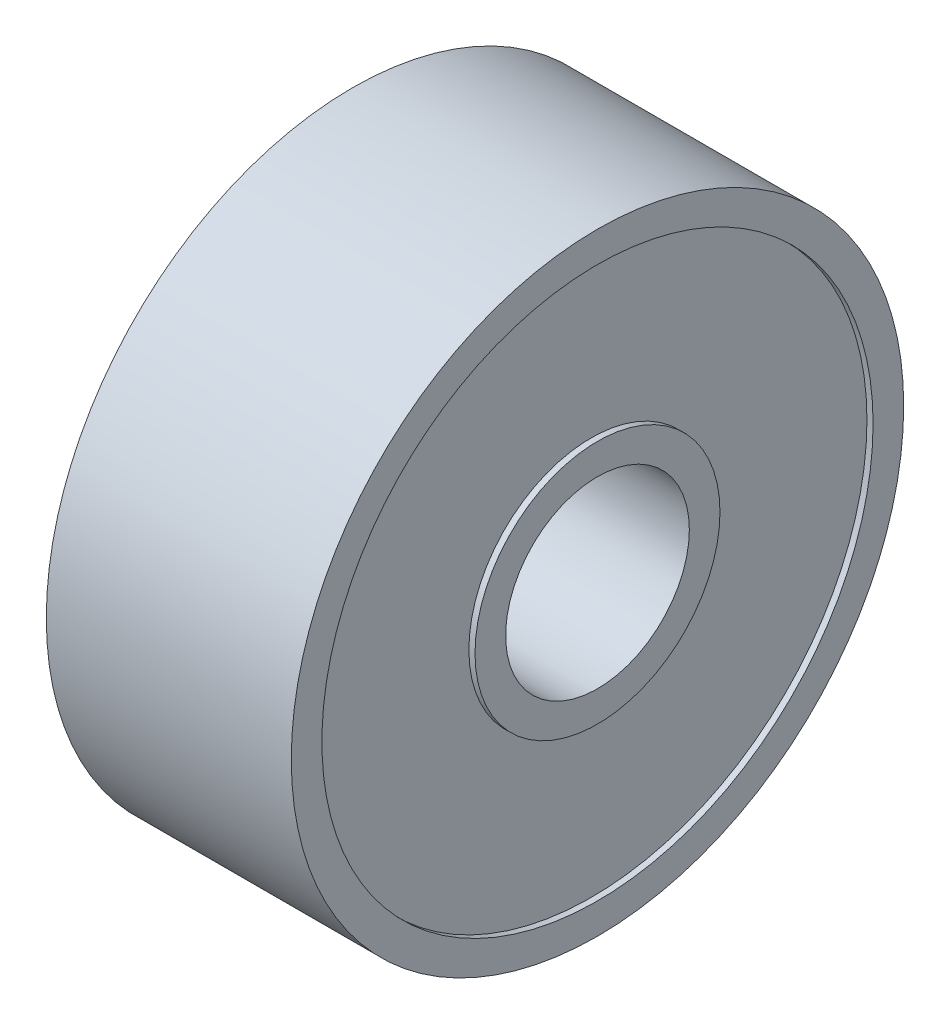
ISO-10303-21;
HEADER;
FILE_DESCRIPTION(('STEP AP214'),'2;1');
FILE_NAME('part.step','',(''),(''),'','','');
FILE_SCHEMA(('AUTOMOTIVE_DESIGN { 1 0 10303 214 1 1 1 1 }'));
ENDSEC;
DATA;
#1=APPLICATION_CONTEXT('core data for automotive mechanical design processes');
#2=APPLICATION_PROTOCOL_DEFINITION('international standard','automotive_design',2000,#1);
#3=PRODUCT_CONTEXT('',#1,'mechanical');
#4=PRODUCT('Part','Part','',(#3));
#5=PRODUCT_RELATED_PRODUCT_CATEGORY('part','',(#4));
#6=PRODUCT_DEFINITION_FORMATION('','',#4);
#7=PRODUCT_DEFINITION_CONTEXT('part definition',#1,'design');
#8=PRODUCT_DEFINITION('design','',#6,#7);
#9=PRODUCT_DEFINITION_SHAPE('','',#8);
#10=(LENGTH_UNIT() NAMED_UNIT(*) SI_UNIT(.MILLI.,.METRE.));
#11=(NAMED_UNIT(*) PLANE_ANGLE_UNIT() SI_UNIT($,.RADIAN.));
#12=(NAMED_UNIT(*) SI_UNIT($,.STERADIAN.) SOLID_ANGLE_UNIT());
#13=UNCERTAINTY_MEASURE_WITH_UNIT(LENGTH_MEASURE(1.E-05),#10,'distance_accuracy_value','');
#14=(GEOMETRIC_REPRESENTATION_CONTEXT(3) GLOBAL_UNCERTAINTY_ASSIGNED_CONTEXT((#13)) GLOBAL_UNIT_ASSIGNED_CONTEXT((#10,
#11,#12)) REPRESENTATION_CONTEXT('',''));
#15=CARTESIAN_POINT('',(0.,0.,0.));
#16=DIRECTION('',(0.,0.,1.));
#17=DIRECTION('',(1.,0.,0.));
#18=AXIS2_PLACEMENT_3D('',#15,#16,#17);
#19=CARTESIAN_POINT('',(0.1,0.,0.));
#20=DIRECTION('',(1.,0.,0.));
#21=DIRECTION('',(0.,1.,0.));
#22=AXIS2_PLACEMENT_3D('',#19,#20,#21);
#23=PLANE('',#22);
#24=CARTESIAN_POINT('',(0.1,0.,0.));
#25=DIRECTION('',(-1.,0.,0.));
#26=DIRECTION('',(0.,0.,-1.));
#27=AXIS2_PLACEMENT_3D('',#24,#25,#26);
#28=CIRCLE('',#27,2.);
#29=CARTESIAN_POINT('',(0.1,0.,-2.));
#30=VERTEX_POINT('',#29);
#31=EDGE_CURVE('E10',#30,#30,#28,.T.);
#32=ORIENTED_EDGE('',*,*,#31,.F.);
#33=EDGE_LOOP('',(#32));
#34=FACE_BOUND('',#33,.T.);
#35=CARTESIAN_POINT('',(0.1,0.,0.));
#36=DIRECTION('',(1.,0.,0.));
#37=DIRECTION('',(0.,0.,1.));
#38=AXIS2_PLACEMENT_3D('',#35,#36,#37);
#39=CIRCLE('',#38,4.5);
#40=CARTESIAN_POINT('',(0.1,0.,4.5));
#41=VERTEX_POINT('',#40);
#42=EDGE_CURVE('E72',#41,#41,#39,.T.);
#43=ORIENTED_EDGE('',*,*,#42,.F.);
#44=EDGE_LOOP('',(#43));
#45=FACE_BOUND('',#44,.T.);
#46=ADVANCED_FACE('F15',(#34,#45),#23,.F.);
#47=CARTESIAN_POINT('',(0.1,0.,0.));
#48=DIRECTION('',(-1.,0.,0.));
#49=DIRECTION('',(0.,0.,1.));
#50=AXIS2_PLACEMENT_3D('',#47,#48,#49);
#51=CYLINDRICAL_SURFACE('',#50,2.);
#52=CARTESIAN_POINT('',(0.,0.,0.));
#53=DIRECTION('',(1.,0.,0.));
#54=DIRECTION('',(0.,0.,-1.));
#55=AXIS2_PLACEMENT_3D('',#52,#53,#54);
#56=CIRCLE('',#55,2.);
#57=CARTESIAN_POINT('',(0.,0.,-2.));
#58=VERTEX_POINT('',#57);
#59=EDGE_CURVE('E22',#58,#58,#56,.T.);
#60=ORIENTED_EDGE('',*,*,#59,.T.);
#61=EDGE_LOOP('',(#60));
#62=FACE_BOUND('',#61,.T.);
#63=ORIENTED_EDGE('',*,*,#31,.T.);
#64=EDGE_LOOP('',(#63));
#65=FACE_BOUND('',#64,.T.);
#66=ADVANCED_FACE('F82',(#62,#65),#51,.T.);
#67=CARTESIAN_POINT('',(0.,0.,0.));
#68=DIRECTION('',(1.,0.,0.));
#69=DIRECTION('',(0.,1.,0.));
#70=AXIS2_PLACEMENT_3D('',#67,#68,#69);
#71=PLANE('',#70);
#72=CARTESIAN_POINT('',(0.,0.,0.));
#73=DIRECTION('',(-1.,0.,0.));
#74=DIRECTION('',(0.,0.,-1.));
#75=AXIS2_PLACEMENT_3D('',#72,#73,#74);
#76=CIRCLE('',#75,1.5);
#77=CARTESIAN_POINT('',(0.,0.,-1.5));
#78=VERTEX_POINT('',#77);
#79=EDGE_CURVE('E31',#78,#78,#76,.T.);
#80=ORIENTED_EDGE('',*,*,#79,.F.);
#81=EDGE_LOOP('',(#80));
#82=FACE_BOUND('',#81,.T.);
#83=ORIENTED_EDGE('',*,*,#59,.F.);
#84=EDGE_LOOP('',(#83));
#85=FACE_BOUND('',#84,.T.);
#86=ADVANCED_FACE('F88',(#82,#85),#71,.F.);
#87=CARTESIAN_POINT('',(4.,0.,0.));
#88=DIRECTION('',(-1.,0.,0.));
#89=DIRECTION('',(0.,0.,1.));
#90=AXIS2_PLACEMENT_3D('',#87,#88,#89);
#91=CYLINDRICAL_SURFACE('',#90,1.5);
#92=ORIENTED_EDGE('',*,*,#79,.T.);
#93=EDGE_LOOP('',(#92));
#94=FACE_BOUND('',#93,.T.);
#95=CARTESIAN_POINT('',(4.,0.,0.));
#96=DIRECTION('',(1.,0.,0.));
#97=DIRECTION('',(0.,0.,-1.));
#98=AXIS2_PLACEMENT_3D('',#95,#96,#97);
#99=CIRCLE('',#98,1.5);
#100=CARTESIAN_POINT('',(4.,0.,-1.5));
#101=VERTEX_POINT('',#100);
#102=EDGE_CURVE('E38',#101,#101,#99,.T.);
#103=ORIENTED_EDGE('',*,*,#102,.T.);
#104=EDGE_LOOP('',(#103));
#105=FACE_BOUND('',#104,.T.);
#106=ADVANCED_FACE('F93',(#94,#105),#91,.F.);
#107=CARTESIAN_POINT('',(4.,0.,0.));
#108=DIRECTION('',(1.,0.,0.));
#109=DIRECTION('',(0.,1.,0.));
#110=AXIS2_PLACEMENT_3D('',#107,#108,#109);
#111=PLANE('',#110);
#112=ORIENTED_EDGE('',*,*,#102,.F.);
#113=EDGE_LOOP('',(#112));
#114=FACE_BOUND('',#113,.T.);
#115=CARTESIAN_POINT('',(4.,0.,0.));
#116=DIRECTION('',(-1.,0.,0.));
#117=DIRECTION('',(0.,0.,-1.));
#118=AXIS2_PLACEMENT_3D('',#115,#116,#117);
#119=CIRCLE('',#118,2.);
#120=CARTESIAN_POINT('',(4.,0.,-2.));
#121=VERTEX_POINT('',#120);
#122=EDGE_CURVE('E44',#121,#121,#119,.T.);
#123=ORIENTED_EDGE('',*,*,#122,.F.);
#124=EDGE_LOOP('',(#123));
#125=FACE_BOUND('',#124,.T.);
#126=ADVANCED_FACE('F118',(#114,#125),#111,.T.);
#127=CARTESIAN_POINT('',(4.,0.,0.));
#128=DIRECTION('',(-1.,0.,0.));
#129=DIRECTION('',(0.,0.,1.));
#130=AXIS2_PLACEMENT_3D('',#127,#128,#129);
#131=CYLINDRICAL_SURFACE('',#130,2.);
#132=CARTESIAN_POINT('',(3.9,0.,0.));
#133=DIRECTION('',(1.,0.,0.));
#134=DIRECTION('',(0.,0.,-1.));
#135=AXIS2_PLACEMENT_3D('',#132,#133,#134);
#136=CIRCLE('',#135,2.);
#137=CARTESIAN_POINT('',(3.9,0.,-2.));
#138=VERTEX_POINT('',#137);
#139=EDGE_CURVE('E48',#138,#138,#136,.T.);
#140=ORIENTED_EDGE('',*,*,#139,.T.);
#141=EDGE_LOOP('',(#140));
#142=FACE_BOUND('',#141,.T.);
#143=ORIENTED_EDGE('',*,*,#122,.T.);
#144=EDGE_LOOP('',(#143));
#145=FACE_BOUND('',#144,.T.);
#146=ADVANCED_FACE('F108',(#142,#145),#131,.T.);
#147=CARTESIAN_POINT('',(3.9,0.,0.));
#148=DIRECTION('',(1.,0.,0.));
#149=DIRECTION('',(0.,1.,0.));
#150=AXIS2_PLACEMENT_3D('',#147,#148,#149);
#151=PLANE('',#150);
#152=ORIENTED_EDGE('',*,*,#139,.F.);
#153=EDGE_LOOP('',(#152));
#154=FACE_BOUND('',#153,.T.);
#155=CARTESIAN_POINT('',(3.9,0.,0.));
#156=DIRECTION('',(-1.,0.,0.));
#157=DIRECTION('',(0.,0.,-1.));
#158=AXIS2_PLACEMENT_3D('',#155,#156,#157);
#159=CIRCLE('',#158,4.5);
#160=CARTESIAN_POINT('',(3.9,0.,-4.5));
#161=VERTEX_POINT('',#160);
#162=EDGE_CURVE('E52',#161,#161,#159,.T.);
#163=ORIENTED_EDGE('',*,*,#162,.F.);
#164=EDGE_LOOP('',(#163));
#165=FACE_BOUND('',#164,.T.);
#166=ADVANCED_FACE('F104',(#154,#165),#151,.T.);
#167=CARTESIAN_POINT('',(4.,0.,0.));
#168=DIRECTION('',(-1.,0.,0.));
#169=DIRECTION('',(0.,0.,1.));
#170=AXIS2_PLACEMENT_3D('',#167,#168,#169);
#171=CYLINDRICAL_SURFACE('',#170,4.5);
#172=ORIENTED_EDGE('',*,*,#162,.T.);
#173=EDGE_LOOP('',(#172));
#174=FACE_BOUND('',#173,.T.);
#175=CARTESIAN_POINT('',(4.,0.,0.));
#176=DIRECTION('',(1.,0.,0.));
#177=DIRECTION('',(0.,0.,-1.));
#178=AXIS2_PLACEMENT_3D('',#175,#176,#177);
#179=CIRCLE('',#178,4.5);
#180=CARTESIAN_POINT('',(4.,0.,-4.5));
#181=VERTEX_POINT('',#180);
#182=EDGE_CURVE('E57',#181,#181,#179,.T.);
#183=ORIENTED_EDGE('',*,*,#182,.T.);
#184=EDGE_LOOP('',(#183));
#185=FACE_BOUND('',#184,.T.);
#186=ADVANCED_FACE('F107',(#174,#185),#171,.F.);
#187=CARTESIAN_POINT('',(4.,0.,0.));
#188=DIRECTION('',(1.,0.,0.));
#189=DIRECTION('',(0.,1.,0.));
#190=AXIS2_PLACEMENT_3D('',#187,#188,#189);
#191=PLANE('',#190);
#192=ORIENTED_EDGE('',*,*,#182,.F.);
#193=EDGE_LOOP('',(#192));
#194=FACE_BOUND('',#193,.T.);
#195=CARTESIAN_POINT('',(4.,0.,0.));
#196=DIRECTION('',(-1.,0.,0.));
#197=DIRECTION('',(0.,0.,-1.));
#198=AXIS2_PLACEMENT_3D('',#195,#196,#197);
#199=CIRCLE('',#198,5.);
#200=CARTESIAN_POINT('',(4.,0.,-5.));
#201=VERTEX_POINT('',#200);
#202=EDGE_CURVE('E53',#201,#201,#199,.T.);
#203=ORIENTED_EDGE('',*,*,#202,.F.);
#204=EDGE_LOOP('',(#203));
#205=FACE_BOUND('',#204,.T.);
#206=ADVANCED_FACE('F102',(#194,#205),#191,.T.);
#207=CARTESIAN_POINT('',(4.,0.,0.));
#208=DIRECTION('',(-1.,0.,0.));
#209=DIRECTION('',(0.,0.,1.));
#210=AXIS2_PLACEMENT_3D('',#207,#208,#209);
#211=CYLINDRICAL_SURFACE('',#210,5.);
#212=CARTESIAN_POINT('',(0.,0.,0.));
#213=DIRECTION('',(1.,0.,0.));
#214=DIRECTION('',(0.,0.,-1.));
#215=AXIS2_PLACEMENT_3D('',#212,#213,#214);
#216=CIRCLE('',#215,5.);
#217=CARTESIAN_POINT('',(0.,0.,-5.));
#218=VERTEX_POINT('',#217);
#219=EDGE_CURVE('E58',#218,#218,#216,.T.);
#220=ORIENTED_EDGE('',*,*,#219,.T.);
#221=EDGE_LOOP('',(#220));
#222=FACE_BOUND('',#221,.T.);
#223=ORIENTED_EDGE('',*,*,#202,.T.);
#224=EDGE_LOOP('',(#223));
#225=FACE_BOUND('',#224,.T.);
#226=ADVANCED_FACE('F99',(#222,#225),#211,.T.);
#227=CARTESIAN_POINT('',(0.,0.,0.));
#228=DIRECTION('',(1.,0.,0.));
#229=DIRECTION('',(0.,1.,0.));
#230=AXIS2_PLACEMENT_3D('',#227,#228,#229);
#231=PLANE('',#230);
#232=CARTESIAN_POINT('',(0.,0.,0.));
#233=DIRECTION('',(-1.,0.,0.));
#234=DIRECTION('',(0.,0.,-1.));
#235=AXIS2_PLACEMENT_3D('',#232,#233,#234);
#236=CIRCLE('',#235,4.5);
#237=CARTESIAN_POINT('',(0.,0.,-4.5));
#238=VERTEX_POINT('',#237);
#239=EDGE_CURVE('E65',#238,#238,#236,.T.);
#240=ORIENTED_EDGE('',*,*,#239,.F.);
#241=EDGE_LOOP('',(#240));
#242=FACE_BOUND('',#241,.T.);
#243=ORIENTED_EDGE('',*,*,#219,.F.);
#244=EDGE_LOOP('',(#243));
#245=FACE_BOUND('',#244,.T.);
#246=ADVANCED_FACE('F97',(#242,#245),#231,.F.);
#247=CARTESIAN_POINT('',(0.1,0.,0.));
#248=DIRECTION('',(-1.,0.,0.));
#249=DIRECTION('',(0.,0.,1.));
#250=AXIS2_PLACEMENT_3D('',#247,#248,#249);
#251=CYLINDRICAL_SURFACE('',#250,4.5);
#252=ORIENTED_EDGE('',*,*,#239,.T.);
#253=EDGE_LOOP('',(#252));
#254=FACE_BOUND('',#253,.T.);
#255=ORIENTED_EDGE('',*,*,#42,.T.);
#256=EDGE_LOOP('',(#255));
#257=FACE_BOUND('',#256,.T.);
#258=ADVANCED_FACE('F79',(#254,#257),#251,.F.);
#259=CLOSED_SHELL('',(#46,#66,#86,#106,#126,#146,#166,#186,#206,#226,#246,#258));
#260=MANIFOLD_SOLID_BREP('B1',#259);
#261=ADVANCED_BREP_SHAPE_REPRESENTATION('',(#18,#260),#14);
#262=SHAPE_DEFINITION_REPRESENTATION(#9,#261);
ENDSEC;
END-ISO-10303-21;
